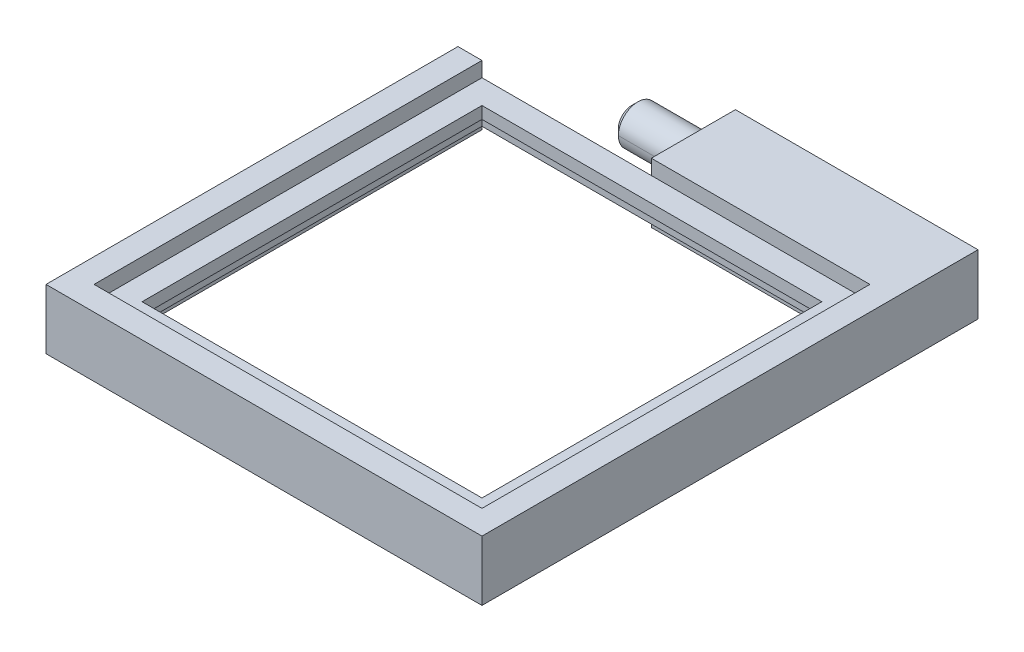
ISO-10303-21;
HEADER;
FILE_DESCRIPTION(('STEP AP214'),'2;1');
FILE_NAME('part.step','',(''),(''),'','','');
FILE_SCHEMA(('AUTOMOTIVE_DESIGN { 1 0 10303 214 1 1 1 1 }'));
ENDSEC;
DATA;
#1=APPLICATION_CONTEXT('core data for automotive mechanical design processes');
#2=APPLICATION_PROTOCOL_DEFINITION('international standard','automotive_design',2000,#1);
#3=PRODUCT_CONTEXT('',#1,'mechanical');
#4=PRODUCT('Part','Part','',(#3));
#5=PRODUCT_RELATED_PRODUCT_CATEGORY('part','',(#4));
#6=PRODUCT_DEFINITION_FORMATION('','',#4);
#7=PRODUCT_DEFINITION_CONTEXT('part definition',#1,'design');
#8=PRODUCT_DEFINITION('design','',#6,#7);
#9=PRODUCT_DEFINITION_SHAPE('','',#8);
#10=(LENGTH_UNIT() NAMED_UNIT(*) SI_UNIT(.MILLI.,.METRE.));
#11=(NAMED_UNIT(*) PLANE_ANGLE_UNIT() SI_UNIT($,.RADIAN.));
#12=(NAMED_UNIT(*) SI_UNIT($,.STERADIAN.) SOLID_ANGLE_UNIT());
#13=UNCERTAINTY_MEASURE_WITH_UNIT(LENGTH_MEASURE(1.E-05),#10,'distance_accuracy_value','');
#14=(GEOMETRIC_REPRESENTATION_CONTEXT(3) GLOBAL_UNCERTAINTY_ASSIGNED_CONTEXT((#13)) GLOBAL_UNIT_ASSIGNED_CONTEXT((#10,
#11,#12)) REPRESENTATION_CONTEXT('',''));
#15=CARTESIAN_POINT('',(0.,0.,0.));
#16=DIRECTION('',(0.,0.,1.));
#17=DIRECTION('',(1.,0.,0.));
#18=AXIS2_PLACEMENT_3D('',#15,#16,#17);
#19=CARTESIAN_POINT('',(8.1,1.25,-36.68));
#20=DIRECTION('',(1.,0.,0.));
#21=DIRECTION('',(0.,0.,-1.));
#22=AXIS2_PLACEMENT_3D('',#19,#20,#21);
#23=CONICAL_SURFACE('',#22,1.125,0.785398163397448);
#24=DIRECTION('',(0.707106781186548,0.,0.707106781186547));
#25=VECTOR('',#24,1.);
#26=CARTESIAN_POINT('',(8.1,1.25,-35.555));
#27=LINE('',#26,#25);
#28=CARTESIAN_POINT('',(8.1,1.25,-35.555));
#29=VERTEX_POINT('',#28);
#30=CARTESIAN_POINT('',(8.6,1.25,-35.055));
#31=VERTEX_POINT('',#30);
#32=EDGE_CURVE('E335',#29,#31,#27,.T.);
#33=ORIENTED_EDGE('',*,*,#32,.F.);
#34=CARTESIAN_POINT('',(8.1,1.25,-36.68));
#35=DIRECTION('',(-1.,0.,0.));
#36=DIRECTION('',(0.,0.,1.));
#37=AXIS2_PLACEMENT_3D('',#34,#35,#36);
#38=CIRCLE('',#37,1.125);
#39=CARTESIAN_POINT('',(8.1,1.25,-37.805));
#40=VERTEX_POINT('',#39);
#41=EDGE_CURVE('E11',#40,#29,#38,.T.);
#42=ORIENTED_EDGE('',*,*,#41,.F.);
#43=DIRECTION('',(0.707106781186548,0.,-0.707106781186547));
#44=VECTOR('',#43,1.);
#45=CARTESIAN_POINT('',(8.1,1.25,-37.805));
#46=LINE('',#45,#44);
#47=CARTESIAN_POINT('',(8.6,1.25,-38.305));
#48=VERTEX_POINT('',#47);
#49=EDGE_CURVE('E365',#40,#48,#46,.T.);
#50=ORIENTED_EDGE('',*,*,#49,.T.);
#51=CARTESIAN_POINT('',(8.6,1.25,-36.68));
#52=DIRECTION('',(1.,0.,0.));
#53=DIRECTION('',(0.,0.,1.));
#54=AXIS2_PLACEMENT_3D('',#51,#52,#53);
#55=CIRCLE('',#54,1.625);
#56=EDGE_CURVE('E435',#31,#48,#55,.T.);
#57=ORIENTED_EDGE('',*,*,#56,.F.);
#58=EDGE_LOOP('',(#33,#42,#50,#57));
#59=FACE_BOUND('',#58,.T.);
#60=ADVANCED_FACE('F44',(#59),#23,.T.);
#61=CARTESIAN_POINT('',(13.6,1.25,-36.68));
#62=DIRECTION('',(1.,0.,0.));
#63=DIRECTION('',(0.,0.,-1.));
#64=AXIS2_PLACEMENT_3D('',#61,#62,#63);
#65=CONICAL_SURFACE('',#64,1.625,0.785398163397445);
#66=DIRECTION('',(0.707106781186551,0.,0.707106781186545));
#67=VECTOR('',#66,1.);
#68=CARTESIAN_POINT('',(13.6,1.25,-35.055));
#69=LINE('',#68,#67);
#70=CARTESIAN_POINT('',(13.6,1.25,-35.055));
#71=VERTEX_POINT('',#70);
#72=CARTESIAN_POINT('',(14.1,1.25,-34.555));
#73=VERTEX_POINT('',#72);
#74=EDGE_CURVE('E345',#71,#73,#69,.T.);
#75=ORIENTED_EDGE('',*,*,#74,.F.);
#76=CARTESIAN_POINT('',(13.6,1.25,-36.68));
#77=DIRECTION('',(-1.,0.,0.));
#78=DIRECTION('',(0.,0.,-1.));
#79=AXIS2_PLACEMENT_3D('',#76,#77,#78);
#80=CIRCLE('',#79,1.625);
#81=CARTESIAN_POINT('',(13.6,1.25,-38.305));
#82=VERTEX_POINT('',#81);
#83=EDGE_CURVE('E48',#82,#71,#80,.T.);
#84=ORIENTED_EDGE('',*,*,#83,.F.);
#85=DIRECTION('',(0.707106781186551,0.,-0.707106781186545));
#86=VECTOR('',#85,1.);
#87=CARTESIAN_POINT('',(13.6,1.25,-38.305));
#88=LINE('',#87,#86);
#89=CARTESIAN_POINT('',(14.1,1.25,-38.805));
#90=VERTEX_POINT('',#89);
#91=EDGE_CURVE('E331',#82,#90,#88,.T.);
#92=ORIENTED_EDGE('',*,*,#91,.T.);
#93=CARTESIAN_POINT('',(14.1,1.25,-36.68));
#94=DIRECTION('',(1.,0.,0.));
#95=DIRECTION('',(0.,0.,-1.));
#96=AXIS2_PLACEMENT_3D('',#93,#94,#95);
#97=CIRCLE('',#96,2.125);
#98=EDGE_CURVE('E513',#73,#90,#97,.T.);
#99=ORIENTED_EDGE('',*,*,#98,.F.);
#100=EDGE_LOOP('',(#75,#84,#92,#99));
#101=FACE_BOUND('',#100,.T.);
#102=ADVANCED_FACE('F554',(#101),#65,.T.);
#103=CARTESIAN_POINT('',(8.1,1.25,-36.68));
#104=DIRECTION('',(-1.,0.,0.));
#105=DIRECTION('',(0.,0.,1.));
#106=AXIS2_PLACEMENT_3D('',#103,#104,#105);
#107=PLANE('',#106);
#108=ORIENTED_EDGE('',*,*,#41,.T.);
#109=CARTESIAN_POINT('',(8.1,1.25,-36.68));
#110=DIRECTION('',(-1.,0.,0.));
#111=DIRECTION('',(0.,0.,1.));
#112=AXIS2_PLACEMENT_3D('',#109,#110,#111);
#113=CIRCLE('',#112,1.125);
#114=EDGE_CURVE('E329',#29,#40,#113,.T.);
#115=ORIENTED_EDGE('',*,*,#114,.T.);
#116=EDGE_LOOP('',(#108,#115));
#117=FACE_BOUND('',#116,.T.);
#118=ADVANCED_FACE('F631',(#117),#107,.T.);
#119=CARTESIAN_POINT('',(8.1,1.25,-36.68));
#120=DIRECTION('',(1.,0.,0.));
#121=DIRECTION('',(0.,0.,-1.));
#122=AXIS2_PLACEMENT_3D('',#119,#120,#121);
#123=CYLINDRICAL_SURFACE('',#122,1.625);
#124=DIRECTION('',(1.,0.,0.));
#125=VECTOR('',#124,1.);
#126=CARTESIAN_POINT('',(8.1,1.25,-35.055));
#127=LINE('',#126,#125);
#128=EDGE_CURVE('E340',#31,#71,#127,.T.);
#129=ORIENTED_EDGE('',*,*,#128,.F.);
#130=ORIENTED_EDGE('',*,*,#56,.T.);
#131=DIRECTION('',(1.,0.,0.));
#132=VECTOR('',#131,1.);
#133=CARTESIAN_POINT('',(8.1,1.25,-38.305));
#134=LINE('',#133,#132);
#135=EDGE_CURVE('E398',#48,#82,#134,.T.);
#136=ORIENTED_EDGE('',*,*,#135,.T.);
#137=ORIENTED_EDGE('',*,*,#83,.T.);
#138=EDGE_LOOP('',(#129,#130,#136,#137));
#139=FACE_BOUND('',#138,.T.);
#140=ADVANCED_FACE('F544',(#139),#123,.T.);
#141=CARTESIAN_POINT('',(0.,0.,-32.3));
#142=DIRECTION('',(0.,0.,1.));
#143=DIRECTION('',(1.,0.,0.));
#144=AXIS2_PLACEMENT_3D('',#141,#142,#143);
#145=PLANE('',#144);
#146=DIRECTION('',(0.,-1.,0.));
#147=VECTOR('',#146,1.);
#148=CARTESIAN_POINT('',(32.3,3.75,-32.3));
#149=LINE('',#148,#147);
#150=CARTESIAN_POINT('',(32.3,0.,-32.3));
#151=VERTEX_POINT('',#150);
#152=CARTESIAN_POINT('',(32.3,-1.25,-32.3));
#153=VERTEX_POINT('',#152);
#154=EDGE_CURVE('E385',#151,#153,#149,.T.);
#155=ORIENTED_EDGE('',*,*,#154,.F.);
#156=DIRECTION('',(-1.,0.,0.));
#157=VECTOR('',#156,1.);
#158=CARTESIAN_POINT('',(0.,0.,-32.3));
#159=LINE('',#158,#157);
#160=CARTESIAN_POINT('',(14.1,0.,-32.3));
#161=VERTEX_POINT('',#160);
#162=EDGE_CURVE('E485',#151,#161,#159,.T.);
#163=ORIENTED_EDGE('',*,*,#162,.T.);
#164=DIRECTION('',(0.,1.,0.));
#165=VECTOR('',#164,1.);
#166=CARTESIAN_POINT('',(14.1,3.75,-32.3));
#167=LINE('',#166,#165);
#168=CARTESIAN_POINT('',(14.1,-1.25,-32.3));
#169=VERTEX_POINT('',#168);
#170=EDGE_CURVE('E370',#169,#161,#167,.T.);
#171=ORIENTED_EDGE('',*,*,#170,.F.);
#172=DIRECTION('',(-1.,0.,0.));
#173=VECTOR('',#172,1.);
#174=CARTESIAN_POINT('',(14.1,-1.25,-32.3));
#175=LINE('',#174,#173);
#176=EDGE_CURVE('E431',#153,#169,#175,.T.);
#177=ORIENTED_EDGE('',*,*,#176,.F.);
#178=EDGE_LOOP('',(#155,#163,#171,#177));
#179=FACE_BOUND('',#178,.T.);
#180=ADVANCED_FACE('F572',(#179),#145,.T.);
#181=CARTESIAN_POINT('',(0.,0.,-39.3));
#182=DIRECTION('',(0.,0.,1.));
#183=DIRECTION('',(1.,0.,0.));
#184=AXIS2_PLACEMENT_3D('',#181,#182,#183);
#185=PLANE('',#184);
#186=DIRECTION('',(0.,1.,0.));
#187=VECTOR('',#186,1.);
#188=CARTESIAN_POINT('',(14.1,3.75,-39.3));
#189=LINE('',#188,#187);
#190=CARTESIAN_POINT('',(14.1,-1.25,-39.3));
#191=VERTEX_POINT('',#190);
#192=CARTESIAN_POINT('',(14.1,3.75,-39.3));
#193=VERTEX_POINT('',#192);
#194=EDGE_CURVE('E515',#191,#193,#189,.T.);
#195=ORIENTED_EDGE('',*,*,#194,.T.);
#196=DIRECTION('',(1.,0.,0.));
#197=VECTOR('',#196,1.);
#198=CARTESIAN_POINT('',(14.1,3.75,-39.3));
#199=LINE('',#198,#197);
#200=CARTESIAN_POINT('',(34.3,3.75,-39.3));
#201=VERTEX_POINT('',#200);
#202=EDGE_CURVE('E77',#193,#201,#199,.T.);
#203=ORIENTED_EDGE('',*,*,#202,.T.);
#204=DIRECTION('',(0.,-1.,0.));
#205=VECTOR('',#204,1.);
#206=CARTESIAN_POINT('',(34.3,58.735270754994,-39.3));
#207=LINE('',#206,#205);
#208=CARTESIAN_POINT('',(34.3,-1.25,-39.3));
#209=VERTEX_POINT('',#208);
#210=EDGE_CURVE('E321',#201,#209,#207,.T.);
#211=ORIENTED_EDGE('',*,*,#210,.T.);
#212=DIRECTION('',(-1.,0.,0.));
#213=VECTOR('',#212,1.);
#214=CARTESIAN_POINT('',(14.1,-1.25,-39.3));
#215=LINE('',#214,#213);
#216=EDGE_CURVE('E67',#209,#191,#215,.T.);
#217=ORIENTED_EDGE('',*,*,#216,.T.);
#218=EDGE_LOOP('',(#195,#203,#211,#217));
#219=FACE_BOUND('',#218,.T.);
#220=ADVANCED_FACE('F614',(#219),#185,.F.);
#221=CARTESIAN_POINT('',(14.1,-1.25,-39.3));
#222=DIRECTION('',(0.,1.,0.));
#223=DIRECTION('',(1.,0.,0.));
#224=AXIS2_PLACEMENT_3D('',#221,#222,#223);
#225=PLANE('',#224);
#226=ORIENTED_EDGE('',*,*,#176,.T.);
#227=DIRECTION('',(0.,0.,1.));
#228=VECTOR('',#227,1.);
#229=CARTESIAN_POINT('',(14.1,-1.25,-39.3));
#230=LINE('',#229,#228);
#231=EDGE_CURVE('E510',#191,#169,#230,.T.);
#232=ORIENTED_EDGE('',*,*,#231,.F.);
#233=ORIENTED_EDGE('',*,*,#216,.F.);
#234=DIRECTION('',(0.,0.,1.));
#235=VECTOR('',#234,1.);
#236=CARTESIAN_POINT('',(34.3,-1.25,-39.3));
#237=LINE('',#236,#235);
#238=CARTESIAN_POINT('',(34.3,-1.25,2.));
#239=VERTEX_POINT('',#238);
#240=EDGE_CURVE('E303',#209,#239,#237,.T.);
#241=ORIENTED_EDGE('',*,*,#240,.T.);
#242=DIRECTION('',(-1.,0.,0.));
#243=VECTOR('',#242,1.);
#244=CARTESIAN_POINT('',(34.2417068542968,-1.25,2.));
#245=LINE('',#244,#243);
#246=CARTESIAN_POINT('',(-2.,-1.25,2.));
#247=VERTEX_POINT('',#246);
#248=EDGE_CURVE('E305',#239,#247,#245,.T.);
#249=ORIENTED_EDGE('',*,*,#248,.T.);
#250=DIRECTION('',(0.,0.,-1.));
#251=VECTOR('',#250,1.);
#252=CARTESIAN_POINT('',(-2.,-1.25,-32.3));
#253=LINE('',#252,#251);
#254=CARTESIAN_POINT('',(-2.,-1.25,-32.3));
#255=VERTEX_POINT('',#254);
#256=EDGE_CURVE('E310',#247,#255,#253,.T.);
#257=ORIENTED_EDGE('',*,*,#256,.T.);
#258=DIRECTION('',(1.,0.,0.));
#259=VECTOR('',#258,1.);
#260=CARTESIAN_POINT('',(0.,-1.25,-32.3));
#261=LINE('',#260,#259);
#262=CARTESIAN_POINT('',(0.,-1.25,-32.3));
#263=VERTEX_POINT('',#262);
#264=EDGE_CURVE('E279',#255,#263,#261,.T.);
#265=ORIENTED_EDGE('',*,*,#264,.T.);
#266=DIRECTION('',(0.,0.,1.));
#267=VECTOR('',#266,1.);
#268=CARTESIAN_POINT('',(0.,-1.25,-32.3));
#269=LINE('',#268,#267);
#270=CARTESIAN_POINT('',(0.,-1.25,0.));
#271=VERTEX_POINT('',#270);
#272=EDGE_CURVE('E273',#263,#271,#269,.T.);
#273=ORIENTED_EDGE('',*,*,#272,.T.);
#274=DIRECTION('',(1.,0.,0.));
#275=VECTOR('',#274,1.);
#276=CARTESIAN_POINT('',(32.3,-1.25,0.));
#277=LINE('',#276,#275);
#278=CARTESIAN_POINT('',(32.3,-1.25,0.));
#279=VERTEX_POINT('',#278);
#280=EDGE_CURVE('E284',#271,#279,#277,.T.);
#281=ORIENTED_EDGE('',*,*,#280,.T.);
#282=DIRECTION('',(0.,0.,-1.));
#283=VECTOR('',#282,1.);
#284=CARTESIAN_POINT('',(32.3,-1.25,-39.3));
#285=LINE('',#284,#283);
#286=EDGE_CURVE('E289',#279,#153,#285,.T.);
#287=ORIENTED_EDGE('',*,*,#286,.T.);
#288=EDGE_LOOP('',(#226,#232,#233,#241,#249,#257,#265,#273,#281,#287));
#289=FACE_BOUND('',#288,.T.);
#290=ADVANCED_FACE('F295',(#289),#225,.F.);
#291=CARTESIAN_POINT('',(14.1,3.75,-39.3));
#292=DIRECTION('',(0.,-1.,0.));
#293=DIRECTION('',(-1.,0.,0.));
#294=AXIS2_PLACEMENT_3D('',#291,#292,#293);
#295=PLANE('',#294);
#296=DIRECTION('',(1.,0.,0.));
#297=VECTOR('',#296,1.);
#298=CARTESIAN_POINT('',(14.1,3.75,-32.3));
#299=LINE('',#298,#297);
#300=CARTESIAN_POINT('',(14.1,3.75,-32.3));
#301=VERTEX_POINT('',#300);
#302=CARTESIAN_POINT('',(32.3,3.75,-32.3));
#303=VERTEX_POINT('',#302);
#304=EDGE_CURVE('E367',#301,#303,#299,.T.);
#305=ORIENTED_EDGE('',*,*,#304,.T.);
#306=DIRECTION('',(0.,0.,1.));
#307=VECTOR('',#306,1.);
#308=CARTESIAN_POINT('',(32.3,3.75,-39.3));
#309=LINE('',#308,#307);
#310=CARTESIAN_POINT('',(32.3,3.75,0.));
#311=VERTEX_POINT('',#310);
#312=EDGE_CURVE('E313',#303,#311,#309,.T.);
#313=ORIENTED_EDGE('',*,*,#312,.T.);
#314=DIRECTION('',(-1.,0.,0.));
#315=VECTOR('',#314,1.);
#316=CARTESIAN_POINT('',(32.3,3.75,0.));
#317=LINE('',#316,#315);
#318=CARTESIAN_POINT('',(0.,3.75000000000001,0.));
#319=VERTEX_POINT('',#318);
#320=EDGE_CURVE('E327',#311,#319,#317,.T.);
#321=ORIENTED_EDGE('',*,*,#320,.T.);
#322=DIRECTION('',(0.,0.,-1.));
#323=VECTOR('',#322,1.);
#324=CARTESIAN_POINT('',(0.,3.75,-32.3));
#325=LINE('',#324,#323);
#326=CARTESIAN_POINT('',(0.,3.75,-32.3));
#327=VERTEX_POINT('',#326);
#328=EDGE_CURVE('E300',#319,#327,#325,.T.);
#329=ORIENTED_EDGE('',*,*,#328,.T.);
#330=DIRECTION('',(-1.,0.,0.));
#331=VECTOR('',#330,1.);
#332=CARTESIAN_POINT('',(0.,3.75,-32.3));
#333=LINE('',#332,#331);
#334=CARTESIAN_POINT('',(-2.,3.75,-32.3));
#335=VERTEX_POINT('',#334);
#336=EDGE_CURVE('E603',#327,#335,#333,.T.);
#337=ORIENTED_EDGE('',*,*,#336,.T.);
#338=DIRECTION('',(0.,0.,1.));
#339=VECTOR('',#338,1.);
#340=CARTESIAN_POINT('',(-2.,3.75,-32.3));
#341=LINE('',#340,#339);
#342=CARTESIAN_POINT('',(-2.,3.75000000000001,2.));
#343=VERTEX_POINT('',#342);
#344=EDGE_CURVE('E605',#335,#343,#341,.T.);
#345=ORIENTED_EDGE('',*,*,#344,.T.);
#346=DIRECTION('',(1.,0.,0.));
#347=VECTOR('',#346,1.);
#348=CARTESIAN_POINT('',(34.2417068542968,3.75,2.));
#349=LINE('',#348,#347);
#350=CARTESIAN_POINT('',(34.3,3.75,2.));
#351=VERTEX_POINT('',#350);
#352=EDGE_CURVE('E602',#343,#351,#349,.T.);
#353=ORIENTED_EDGE('',*,*,#352,.T.);
#354=DIRECTION('',(0.,0.,-1.));
#355=VECTOR('',#354,1.);
#356=CARTESIAN_POINT('',(34.3,3.75,-39.3));
#357=LINE('',#356,#355);
#358=EDGE_CURVE('E595',#351,#201,#357,.T.);
#359=ORIENTED_EDGE('',*,*,#358,.T.);
#360=ORIENTED_EDGE('',*,*,#202,.F.);
#361=DIRECTION('',(0.,0.,1.));
#362=VECTOR('',#361,1.);
#363=CARTESIAN_POINT('',(14.1,3.75,-39.3));
#364=LINE('',#363,#362);
#365=EDGE_CURVE('E518',#193,#301,#364,.T.);
#366=ORIENTED_EDGE('',*,*,#365,.T.);
#367=EDGE_LOOP('',(#305,#313,#321,#329,#337,#345,#353,#359,#360,#366));
#368=FACE_BOUND('',#367,.T.);
#369=ADVANCED_FACE('F565',(#368),#295,.F.);
#370=CARTESIAN_POINT('',(14.1,3.75,-39.3));
#371=DIRECTION('',(1.,0.,0.));
#372=DIRECTION('',(0.,1.,0.));
#373=AXIS2_PLACEMENT_3D('',#370,#371,#372);
#374=PLANE('',#373);
#375=CARTESIAN_POINT('',(14.1,1.25,-36.68));
#376=DIRECTION('',(1.,0.,0.));
#377=DIRECTION('',(0.,0.,-1.));
#378=AXIS2_PLACEMENT_3D('',#375,#376,#377);
#379=CIRCLE('',#378,2.125);
#380=EDGE_CURVE('E336',#90,#73,#379,.T.);
#381=ORIENTED_EDGE('',*,*,#380,.T.);
#382=ORIENTED_EDGE('',*,*,#98,.T.);
#383=EDGE_LOOP('',(#381,#382));
#384=FACE_BOUND('',#383,.T.);
#385=ORIENTED_EDGE('',*,*,#170,.T.);
#386=DIRECTION('',(0.,1.,0.));
#387=VECTOR('',#386,1.);
#388=CARTESIAN_POINT('',(14.1,3.75,-32.3));
#389=LINE('',#388,#387);
#390=CARTESIAN_POINT('',(14.1,2.5,-32.3));
#391=VERTEX_POINT('',#390);
#392=EDGE_CURVE('E371',#161,#391,#389,.T.);
#393=ORIENTED_EDGE('',*,*,#392,.T.);
#394=DIRECTION('',(0.,1.,0.));
#395=VECTOR('',#394,1.);
#396=CARTESIAN_POINT('',(14.1,3.75,-32.3));
#397=LINE('',#396,#395);
#398=EDGE_CURVE('E363',#391,#301,#397,.T.);
#399=ORIENTED_EDGE('',*,*,#398,.T.);
#400=ORIENTED_EDGE('',*,*,#365,.F.);
#401=ORIENTED_EDGE('',*,*,#194,.F.);
#402=ORIENTED_EDGE('',*,*,#231,.T.);
#403=EDGE_LOOP('',(#385,#393,#399,#400,#401,#402));
#404=FACE_BOUND('',#403,.T.);
#405=ADVANCED_FACE('F556',(#384,#404),#374,.F.);
#406=CARTESIAN_POINT('',(0.,0.,-32.3));
#407=DIRECTION('',(0.,0.,1.));
#408=DIRECTION('',(1.,0.,0.));
#409=AXIS2_PLACEMENT_3D('',#406,#407,#408);
#410=PLANE('',#409);
#411=DIRECTION('',(-1.,0.,0.));
#412=VECTOR('',#411,1.);
#413=CARTESIAN_POINT('',(0.,2.5,-32.3));
#414=LINE('',#413,#412);
#415=CARTESIAN_POINT('',(32.3,2.5,-32.3));
#416=VERTEX_POINT('',#415);
#417=EDGE_CURVE('E347',#416,#391,#414,.T.);
#418=ORIENTED_EDGE('',*,*,#417,.F.);
#419=DIRECTION('',(0.,-1.,0.));
#420=VECTOR('',#419,1.);
#421=CARTESIAN_POINT('',(32.3,3.75,-32.3));
#422=LINE('',#421,#420);
#423=EDGE_CURVE('E406',#303,#416,#422,.T.);
#424=ORIENTED_EDGE('',*,*,#423,.F.);
#425=ORIENTED_EDGE('',*,*,#304,.F.);
#426=ORIENTED_EDGE('',*,*,#398,.F.);
#427=EDGE_LOOP('',(#418,#424,#425,#426));
#428=FACE_BOUND('',#427,.T.);
#429=ADVANCED_FACE('F562',(#428),#410,.T.);
#430=CARTESIAN_POINT('',(2.,1.5,-30.3));
#431=DIRECTION('',(-1.,0.,0.));
#432=DIRECTION('',(0.,0.,1.));
#433=AXIS2_PLACEMENT_3D('',#430,#431,#432);
#434=PLANE('',#433);
#435=DIRECTION('',(0.,0.,1.));
#436=VECTOR('',#435,1.);
#437=CARTESIAN_POINT('',(2.,2.5,-30.3));
#438=LINE('',#437,#436);
#439=CARTESIAN_POINT('',(2.,2.5,-30.3));
#440=VERTEX_POINT('',#439);
#441=CARTESIAN_POINT('',(2.,2.5,-2.));
#442=VERTEX_POINT('',#441);
#443=EDGE_CURVE('E476',#440,#442,#438,.T.);
#444=ORIENTED_EDGE('',*,*,#443,.T.);
#445=DIRECTION('',(0.,1.,0.));
#446=VECTOR('',#445,1.);
#447=CARTESIAN_POINT('',(2.,1.5,-2.));
#448=LINE('',#447,#446);
#449=CARTESIAN_POINT('',(2.,1.5,-2.));
#450=VERTEX_POINT('',#449);
#451=EDGE_CURVE('E517',#450,#442,#448,.T.);
#452=ORIENTED_EDGE('',*,*,#451,.F.);
#453=DIRECTION('',(0.,0.,1.));
#454=VECTOR('',#453,1.);
#455=CARTESIAN_POINT('',(2.,1.5,-30.3));
#456=LINE('',#455,#454);
#457=CARTESIAN_POINT('',(2.,1.5,-30.3));
#458=VERTEX_POINT('',#457);
#459=EDGE_CURVE('E497',#458,#450,#456,.T.);
#460=ORIENTED_EDGE('',*,*,#459,.F.);
#461=DIRECTION('',(0.,1.,0.));
#462=VECTOR('',#461,1.);
#463=CARTESIAN_POINT('',(2.,1.5,-30.3));
#464=LINE('',#463,#462);
#465=EDGE_CURVE('E469',#458,#440,#464,.T.);
#466=ORIENTED_EDGE('',*,*,#465,.T.);
#467=EDGE_LOOP('',(#444,#452,#460,#466));
#468=FACE_BOUND('',#467,.T.);
#469=ADVANCED_FACE('F669',(#468),#434,.F.);
#470=CARTESIAN_POINT('',(2.,1.5,-2.));
#471=DIRECTION('',(0.,0.,1.));
#472=DIRECTION('',(1.,0.,0.));
#473=AXIS2_PLACEMENT_3D('',#470,#471,#472);
#474=PLANE('',#473);
#475=DIRECTION('',(1.,0.,0.));
#476=VECTOR('',#475,1.);
#477=CARTESIAN_POINT('',(2.,2.5,-2.));
#478=LINE('',#477,#476);
#479=CARTESIAN_POINT('',(30.3,2.5,-2.));
#480=VERTEX_POINT('',#479);
#481=EDGE_CURVE('E474',#442,#480,#478,.T.);
#482=ORIENTED_EDGE('',*,*,#481,.T.);
#483=DIRECTION('',(0.,1.,0.));
#484=VECTOR('',#483,1.);
#485=CARTESIAN_POINT('',(30.3,1.5,-2.));
#486=LINE('',#485,#484);
#487=CARTESIAN_POINT('',(30.3,1.5,-2.));
#488=VERTEX_POINT('',#487);
#489=EDGE_CURVE('E467',#488,#480,#486,.T.);
#490=ORIENTED_EDGE('',*,*,#489,.F.);
#491=DIRECTION('',(1.,0.,0.));
#492=VECTOR('',#491,1.);
#493=CARTESIAN_POINT('',(2.,1.5,-2.));
#494=LINE('',#493,#492);
#495=EDGE_CURVE('E502',#450,#488,#494,.T.);
#496=ORIENTED_EDGE('',*,*,#495,.F.);
#497=ORIENTED_EDGE('',*,*,#451,.T.);
#498=EDGE_LOOP('',(#482,#490,#496,#497));
#499=FACE_BOUND('',#498,.T.);
#500=ADVANCED_FACE('F675',(#499),#474,.F.);
#501=CARTESIAN_POINT('',(30.3,1.5,-2.));
#502=DIRECTION('',(1.,0.,0.));
#503=DIRECTION('',(0.,1.,0.));
#504=AXIS2_PLACEMENT_3D('',#501,#502,#503);
#505=PLANE('',#504);
#506=DIRECTION('',(0.,0.,-1.));
#507=VECTOR('',#506,1.);
#508=CARTESIAN_POINT('',(30.3,2.5,-2.));
#509=LINE('',#508,#507);
#510=CARTESIAN_POINT('',(30.3,2.5,-30.3));
#511=VERTEX_POINT('',#510);
#512=EDGE_CURVE('E463',#480,#511,#509,.T.);
#513=ORIENTED_EDGE('',*,*,#512,.T.);
#514=DIRECTION('',(0.,1.,0.));
#515=VECTOR('',#514,1.);
#516=CARTESIAN_POINT('',(30.3,1.5,-30.3));
#517=LINE('',#516,#515);
#518=CARTESIAN_POINT('',(30.3,1.5,-30.3));
#519=VERTEX_POINT('',#518);
#520=EDGE_CURVE('E468',#519,#511,#517,.T.);
#521=ORIENTED_EDGE('',*,*,#520,.F.);
#522=DIRECTION('',(0.,0.,-1.));
#523=VECTOR('',#522,1.);
#524=CARTESIAN_POINT('',(30.3,1.5,-2.));
#525=LINE('',#524,#523);
#526=EDGE_CURVE('E407',#488,#519,#525,.T.);
#527=ORIENTED_EDGE('',*,*,#526,.F.);
#528=ORIENTED_EDGE('',*,*,#489,.T.);
#529=EDGE_LOOP('',(#513,#521,#527,#528));
#530=FACE_BOUND('',#529,.T.);
#531=ADVANCED_FACE('F682',(#530),#505,.F.);
#532=CARTESIAN_POINT('',(30.3,1.5,-30.3));
#533=DIRECTION('',(0.,0.,-1.));
#534=DIRECTION('',(0.,-1.,0.));
#535=AXIS2_PLACEMENT_3D('',#532,#533,#534);
#536=PLANE('',#535);
#537=DIRECTION('',(-1.,0.,0.));
#538=VECTOR('',#537,1.);
#539=CARTESIAN_POINT('',(30.3,2.5,-30.3));
#540=LINE('',#539,#538);
#541=EDGE_CURVE('E353',#511,#440,#540,.T.);
#542=ORIENTED_EDGE('',*,*,#541,.T.);
#543=ORIENTED_EDGE('',*,*,#465,.F.);
#544=DIRECTION('',(-1.,0.,0.));
#545=VECTOR('',#544,1.);
#546=CARTESIAN_POINT('',(30.3,1.5,-30.3));
#547=LINE('',#546,#545);
#548=EDGE_CURVE('E494',#519,#458,#547,.T.);
#549=ORIENTED_EDGE('',*,*,#548,.F.);
#550=ORIENTED_EDGE('',*,*,#520,.T.);
#551=EDGE_LOOP('',(#542,#543,#549,#550));
#552=FACE_BOUND('',#551,.T.);
#553=ADVANCED_FACE('F694',(#552),#536,.F.);
#554=CARTESIAN_POINT('',(0.,1.5,0.));
#555=DIRECTION('',(0.,1.,0.));
#556=DIRECTION('',(1.,0.,0.));
#557=AXIS2_PLACEMENT_3D('',#554,#555,#556);
#558=PLANE('',#557);
#559=ORIENTED_EDGE('',*,*,#526,.T.);
#560=ORIENTED_EDGE('',*,*,#548,.T.);
#561=ORIENTED_EDGE('',*,*,#459,.T.);
#562=ORIENTED_EDGE('',*,*,#495,.T.);
#563=EDGE_LOOP('',(#559,#560,#561,#562));
#564=FACE_BOUND('',#563,.T.);
#565=DIRECTION('',(0.,0.,1.));
#566=VECTOR('',#565,1.);
#567=CARTESIAN_POINT('',(1.,1.5,-31.3));
#568=LINE('',#567,#566);
#569=CARTESIAN_POINT('',(1.,1.5,-31.3));
#570=VERTEX_POINT('',#569);
#571=CARTESIAN_POINT('',(1.,1.5,-1.));
#572=VERTEX_POINT('',#571);
#573=EDGE_CURVE('E442',#570,#572,#568,.T.);
#574=ORIENTED_EDGE('',*,*,#573,.F.);
#575=DIRECTION('',(-1.,0.,0.));
#576=VECTOR('',#575,1.);
#577=CARTESIAN_POINT('',(31.3,1.5,-31.3));
#578=LINE('',#577,#576);
#579=CARTESIAN_POINT('',(31.3,1.5,-31.3));
#580=VERTEX_POINT('',#579);
#581=EDGE_CURVE('E429',#580,#570,#578,.T.);
#582=ORIENTED_EDGE('',*,*,#581,.F.);
#583=DIRECTION('',(0.,0.,-1.));
#584=VECTOR('',#583,1.);
#585=CARTESIAN_POINT('',(31.3,1.5,-1.));
#586=LINE('',#585,#584);
#587=CARTESIAN_POINT('',(31.3,1.5,-1.));
#588=VERTEX_POINT('',#587);
#589=EDGE_CURVE('E420',#588,#580,#586,.T.);
#590=ORIENTED_EDGE('',*,*,#589,.F.);
#591=DIRECTION('',(1.,0.,0.));
#592=VECTOR('',#591,1.);
#593=CARTESIAN_POINT('',(1.,1.5,-1.));
#594=LINE('',#593,#592);
#595=EDGE_CURVE('E351',#572,#588,#594,.T.);
#596=ORIENTED_EDGE('',*,*,#595,.F.);
#597=EDGE_LOOP('',(#574,#582,#590,#596));
#598=FACE_BOUND('',#597,.T.);
#599=ADVANCED_FACE('F695',(#564,#598),#558,.F.);
#600=CARTESIAN_POINT('',(0.,0.,0.));
#601=DIRECTION('',(0.,-1.,0.));
#602=DIRECTION('',(0.,0.,-1.));
#603=AXIS2_PLACEMENT_3D('',#600,#601,#602);
#604=PLANE('',#603);
#605=DIRECTION('',(0.,0.,1.));
#606=VECTOR('',#605,1.);
#607=CARTESIAN_POINT('',(1.,0.,-1.));
#608=LINE('',#607,#606);
#609=CARTESIAN_POINT('',(1.,0.,-31.3));
#610=VERTEX_POINT('',#609);
#611=CARTESIAN_POINT('',(1.,0.,-1.));
#612=VERTEX_POINT('',#611);
#613=EDGE_CURVE('E446',#610,#612,#608,.T.);
#614=ORIENTED_EDGE('',*,*,#613,.T.);
#615=DIRECTION('',(1.,0.,0.));
#616=VECTOR('',#615,1.);
#617=CARTESIAN_POINT('',(1.,0.,-1.));
#618=LINE('',#617,#616);
#619=CARTESIAN_POINT('',(31.3,0.,-1.));
#620=VERTEX_POINT('',#619);
#621=EDGE_CURVE('E412',#612,#620,#618,.T.);
#622=ORIENTED_EDGE('',*,*,#621,.T.);
#623=DIRECTION('',(0.,0.,-1.));
#624=VECTOR('',#623,1.);
#625=CARTESIAN_POINT('',(31.3,0.,-1.));
#626=LINE('',#625,#624);
#627=CARTESIAN_POINT('',(31.3,0.,-31.3));
#628=VERTEX_POINT('',#627);
#629=EDGE_CURVE('E424',#620,#628,#626,.T.);
#630=ORIENTED_EDGE('',*,*,#629,.T.);
#631=DIRECTION('',(-1.,0.,0.));
#632=VECTOR('',#631,1.);
#633=CARTESIAN_POINT('',(1.,0.,-31.3));
#634=LINE('',#633,#632);
#635=EDGE_CURVE('E443',#628,#610,#634,.T.);
#636=ORIENTED_EDGE('',*,*,#635,.T.);
#637=EDGE_LOOP('',(#614,#622,#630,#636));
#638=FACE_BOUND('',#637,.T.);
#639=DIRECTION('',(0.,0.,1.));
#640=VECTOR('',#639,1.);
#641=CARTESIAN_POINT('',(0.,0.,0.));
#642=LINE('',#641,#640);
#643=CARTESIAN_POINT('',(0.,0.,-32.3));
#644=VERTEX_POINT('',#643);
#645=CARTESIAN_POINT('',(0.,0.,0.));
#646=VERTEX_POINT('',#645);
#647=EDGE_CURVE('E276',#644,#646,#642,.T.);
#648=ORIENTED_EDGE('',*,*,#647,.F.);
#649=DIRECTION('',(-1.,0.,0.));
#650=VECTOR('',#649,1.);
#651=CARTESIAN_POINT('',(0.,0.,-32.3));
#652=LINE('',#651,#650);
#653=EDGE_CURVE('E368',#161,#644,#652,.T.);
#654=ORIENTED_EDGE('',*,*,#653,.F.);
#655=ORIENTED_EDGE('',*,*,#162,.F.);
#656=DIRECTION('',(0.,0.,-1.));
#657=VECTOR('',#656,1.);
#658=CARTESIAN_POINT('',(32.3,0.,0.));
#659=LINE('',#658,#657);
#660=CARTESIAN_POINT('',(32.3,0.,0.));
#661=VERTEX_POINT('',#660);
#662=EDGE_CURVE('E381',#661,#151,#659,.T.);
#663=ORIENTED_EDGE('',*,*,#662,.F.);
#664=DIRECTION('',(1.,0.,0.));
#665=VECTOR('',#664,1.);
#666=CARTESIAN_POINT('',(0.,0.,0.));
#667=LINE('',#666,#665);
#668=EDGE_CURVE('E377',#646,#661,#667,.T.);
#669=ORIENTED_EDGE('',*,*,#668,.F.);
#670=EDGE_LOOP('',(#648,#654,#655,#663,#669));
#671=FACE_BOUND('',#670,.T.);
#672=ADVANCED_FACE('F574',(#638,#671),#604,.T.);
#673=CARTESIAN_POINT('',(0.,2.5,0.));
#674=DIRECTION('',(0.,-1.,0.));
#675=DIRECTION('',(0.,0.,-1.));
#676=AXIS2_PLACEMENT_3D('',#673,#674,#675);
#677=PLANE('',#676);
#678=ORIENTED_EDGE('',*,*,#541,.F.);
#679=ORIENTED_EDGE('',*,*,#512,.F.);
#680=ORIENTED_EDGE('',*,*,#481,.F.);
#681=ORIENTED_EDGE('',*,*,#443,.F.);
#682=EDGE_LOOP('',(#678,#679,#680,#681));
#683=FACE_BOUND('',#682,.T.);
#684=DIRECTION('',(0.,0.,1.));
#685=VECTOR('',#684,1.);
#686=CARTESIAN_POINT('',(0.,2.5,0.));
#687=LINE('',#686,#685);
#688=CARTESIAN_POINT('',(0.,2.5,-32.3));
#689=VERTEX_POINT('',#688);
#690=CARTESIAN_POINT('',(0.,2.5,0.));
#691=VERTEX_POINT('',#690);
#692=EDGE_CURVE('E447',#689,#691,#687,.T.);
#693=ORIENTED_EDGE('',*,*,#692,.T.);
#694=DIRECTION('',(1.,0.,0.));
#695=VECTOR('',#694,1.);
#696=CARTESIAN_POINT('',(0.,2.5,0.));
#697=LINE('',#696,#695);
#698=CARTESIAN_POINT('',(32.3,2.5,0.));
#699=VERTEX_POINT('',#698);
#700=EDGE_CURVE('E454',#691,#699,#697,.T.);
#701=ORIENTED_EDGE('',*,*,#700,.T.);
#702=DIRECTION('',(0.,0.,-1.));
#703=VECTOR('',#702,1.);
#704=CARTESIAN_POINT('',(32.3,2.5,0.));
#705=LINE('',#704,#703);
#706=EDGE_CURVE('E355',#699,#416,#705,.T.);
#707=ORIENTED_EDGE('',*,*,#706,.T.);
#708=ORIENTED_EDGE('',*,*,#417,.T.);
#709=DIRECTION('',(-1.,0.,0.));
#710=VECTOR('',#709,1.);
#711=CARTESIAN_POINT('',(0.,2.5,-32.3));
#712=LINE('',#711,#710);
#713=EDGE_CURVE('E374',#391,#689,#712,.T.);
#714=ORIENTED_EDGE('',*,*,#713,.T.);
#715=EDGE_LOOP('',(#693,#701,#707,#708,#714));
#716=FACE_BOUND('',#715,.T.);
#717=ADVANCED_FACE('F585',(#683,#716),#677,.F.);
#718=CARTESIAN_POINT('',(1.,2.5,-1.));
#719=DIRECTION('',(1.,0.,0.));
#720=DIRECTION('',(0.,1.,0.));
#721=AXIS2_PLACEMENT_3D('',#718,#719,#720);
#722=PLANE('',#721);
#723=DIRECTION('',(0.,-1.,0.));
#724=VECTOR('',#723,1.);
#725=CARTESIAN_POINT('',(1.,2.5,-31.3));
#726=LINE('',#725,#724);
#727=EDGE_CURVE('E437',#570,#610,#726,.T.);
#728=ORIENTED_EDGE('',*,*,#727,.F.);
#729=ORIENTED_EDGE('',*,*,#573,.T.);
#730=DIRECTION('',(0.,-1.,0.));
#731=VECTOR('',#730,1.);
#732=CARTESIAN_POINT('',(1.,2.5,-1.));
#733=LINE('',#732,#731);
#734=EDGE_CURVE('E358',#572,#612,#733,.T.);
#735=ORIENTED_EDGE('',*,*,#734,.T.);
#736=ORIENTED_EDGE('',*,*,#613,.F.);
#737=EDGE_LOOP('',(#728,#729,#735,#736));
#738=FACE_BOUND('',#737,.T.);
#739=ADVANCED_FACE('F702',(#738),#722,.T.);
#740=CARTESIAN_POINT('',(1.,2.5,-31.3));
#741=DIRECTION('',(0.,0.,1.));
#742=DIRECTION('',(1.,0.,0.));
#743=AXIS2_PLACEMENT_3D('',#740,#741,#742);
#744=PLANE('',#743);
#745=DIRECTION('',(0.,-1.,0.));
#746=VECTOR('',#745,1.);
#747=CARTESIAN_POINT('',(31.3,2.5,-31.3));
#748=LINE('',#747,#746);
#749=EDGE_CURVE('E423',#580,#628,#748,.T.);
#750=ORIENTED_EDGE('',*,*,#749,.F.);
#751=ORIENTED_EDGE('',*,*,#581,.T.);
#752=ORIENTED_EDGE('',*,*,#727,.T.);
#753=ORIENTED_EDGE('',*,*,#635,.F.);
#754=EDGE_LOOP('',(#750,#751,#752,#753));
#755=FACE_BOUND('',#754,.T.);
#756=ADVANCED_FACE('F710',(#755),#744,.T.);
#757=CARTESIAN_POINT('',(31.3,2.5,-1.));
#758=DIRECTION('',(-1.,0.,0.));
#759=DIRECTION('',(0.,0.,1.));
#760=AXIS2_PLACEMENT_3D('',#757,#758,#759);
#761=PLANE('',#760);
#762=DIRECTION('',(0.,-1.,0.));
#763=VECTOR('',#762,1.);
#764=CARTESIAN_POINT('',(31.3,2.5,-1.));
#765=LINE('',#764,#763);
#766=EDGE_CURVE('E360',#588,#620,#765,.T.);
#767=ORIENTED_EDGE('',*,*,#766,.F.);
#768=ORIENTED_EDGE('',*,*,#589,.T.);
#769=ORIENTED_EDGE('',*,*,#749,.T.);
#770=ORIENTED_EDGE('',*,*,#629,.F.);
#771=EDGE_LOOP('',(#767,#768,#769,#770));
#772=FACE_BOUND('',#771,.T.);
#773=ADVANCED_FACE('F735',(#772),#761,.T.);
#774=CARTESIAN_POINT('',(1.,2.5,-1.));
#775=DIRECTION('',(0.,0.,-1.));
#776=DIRECTION('',(0.,-1.,0.));
#777=AXIS2_PLACEMENT_3D('',#774,#775,#776);
#778=PLANE('',#777);
#779=ORIENTED_EDGE('',*,*,#734,.F.);
#780=ORIENTED_EDGE('',*,*,#595,.T.);
#781=ORIENTED_EDGE('',*,*,#766,.T.);
#782=ORIENTED_EDGE('',*,*,#621,.F.);
#783=EDGE_LOOP('',(#779,#780,#781,#782));
#784=FACE_BOUND('',#783,.T.);
#785=ADVANCED_FACE('F741',(#784),#778,.T.);
#786=CARTESIAN_POINT('',(0.,2.5,-32.3));
#787=DIRECTION('',(0.,0.,1.));
#788=DIRECTION('',(1.,0.,0.));
#789=AXIS2_PLACEMENT_3D('',#786,#787,#788);
#790=PLANE('',#789);
#791=ORIENTED_EDGE('',*,*,#392,.F.);
#792=ORIENTED_EDGE('',*,*,#653,.T.);
#793=DIRECTION('',(0.,-1.,0.));
#794=VECTOR('',#793,1.);
#795=CARTESIAN_POINT('',(0.,58.735270754994,-32.3));
#796=LINE('',#795,#794);
#797=EDGE_CURVE('E312',#644,#263,#796,.T.);
#798=ORIENTED_EDGE('',*,*,#797,.T.);
#799=ORIENTED_EDGE('',*,*,#264,.F.);
#800=DIRECTION('',(0.,-1.,0.));
#801=VECTOR('',#800,1.);
#802=CARTESIAN_POINT('',(-1.99999999999999,58.735270754994,-32.3));
#803=LINE('',#802,#801);
#804=EDGE_CURVE('E314',#335,#255,#803,.T.);
#805=ORIENTED_EDGE('',*,*,#804,.F.);
#806=ORIENTED_EDGE('',*,*,#336,.F.);
#807=EDGE_CURVE('E307',#327,#689,#796,.T.);
#808=ORIENTED_EDGE('',*,*,#807,.T.);
#809=ORIENTED_EDGE('',*,*,#713,.F.);
#810=EDGE_LOOP('',(#791,#792,#798,#799,#805,#806,#808,#809));
#811=FACE_BOUND('',#810,.T.);
#812=ADVANCED_FACE('F576',(#811),#790,.F.);
#813=CARTESIAN_POINT('',(8.1,1.25,-36.68));
#814=DIRECTION('',(1.,0.,0.));
#815=DIRECTION('',(0.,0.,-1.));
#816=AXIS2_PLACEMENT_3D('',#813,#814,#815);
#817=CYLINDRICAL_SURFACE('',#816,1.625);
#818=CARTESIAN_POINT('',(8.6,1.25,-36.68));
#819=DIRECTION('',(1.,0.,0.));
#820=DIRECTION('',(0.,0.,1.));
#821=AXIS2_PLACEMENT_3D('',#818,#819,#820);
#822=CIRCLE('',#821,1.625);
#823=EDGE_CURVE('E348',#48,#31,#822,.T.);
#824=ORIENTED_EDGE('',*,*,#823,.T.);
#825=ORIENTED_EDGE('',*,*,#128,.T.);
#826=CARTESIAN_POINT('',(13.6,1.25,-36.68));
#827=DIRECTION('',(-1.,0.,0.));
#828=DIRECTION('',(0.,0.,-1.));
#829=AXIS2_PLACEMENT_3D('',#826,#827,#828);
#830=CIRCLE('',#829,1.625);
#831=EDGE_CURVE('E376',#71,#82,#830,.T.);
#832=ORIENTED_EDGE('',*,*,#831,.T.);
#833=ORIENTED_EDGE('',*,*,#135,.F.);
#834=EDGE_LOOP('',(#824,#825,#832,#833));
#835=FACE_BOUND('',#834,.T.);
#836=ADVANCED_FACE('F549',(#835),#817,.T.);
#837=CARTESIAN_POINT('',(13.6,1.25,-36.68));
#838=DIRECTION('',(1.,0.,0.));
#839=DIRECTION('',(0.,0.,-1.));
#840=AXIS2_PLACEMENT_3D('',#837,#838,#839);
#841=CONICAL_SURFACE('',#840,1.625,0.785398163397445);
#842=ORIENTED_EDGE('',*,*,#831,.F.);
#843=ORIENTED_EDGE('',*,*,#74,.T.);
#844=ORIENTED_EDGE('',*,*,#380,.F.);
#845=ORIENTED_EDGE('',*,*,#91,.F.);
#846=EDGE_LOOP('',(#842,#843,#844,#845));
#847=FACE_BOUND('',#846,.T.);
#848=ADVANCED_FACE('F558',(#847),#841,.T.);
#849=CARTESIAN_POINT('',(8.1,1.25,-36.68));
#850=DIRECTION('',(1.,0.,0.));
#851=DIRECTION('',(0.,0.,-1.));
#852=AXIS2_PLACEMENT_3D('',#849,#850,#851);
#853=CONICAL_SURFACE('',#852,1.125,0.785398163397448);
#854=ORIENTED_EDGE('',*,*,#114,.F.);
#855=ORIENTED_EDGE('',*,*,#32,.T.);
#856=ORIENTED_EDGE('',*,*,#823,.F.);
#857=ORIENTED_EDGE('',*,*,#49,.F.);
#858=EDGE_LOOP('',(#854,#855,#856,#857));
#859=FACE_BOUND('',#858,.T.);
#860=ADVANCED_FACE('F636',(#859),#853,.T.);
#861=CARTESIAN_POINT('',(32.3,58.735270754994,-39.3));
#862=DIRECTION('',(-1.,0.,0.));
#863=DIRECTION('',(0.,-1.,0.));
#864=AXIS2_PLACEMENT_3D('',#861,#862,#863);
#865=PLANE('',#864);
#866=DIRECTION('',(0.,-1.,0.));
#867=VECTOR('',#866,1.);
#868=CARTESIAN_POINT('',(32.3,58.735270754994,0.));
#869=LINE('',#868,#867);
#870=EDGE_CURVE('E288',#661,#279,#869,.T.);
#871=ORIENTED_EDGE('',*,*,#870,.F.);
#872=ORIENTED_EDGE('',*,*,#662,.T.);
#873=ORIENTED_EDGE('',*,*,#154,.T.);
#874=ORIENTED_EDGE('',*,*,#286,.F.);
#875=EDGE_LOOP('',(#871,#872,#873,#874));
#876=FACE_BOUND('',#875,.T.);
#877=ADVANCED_FACE('F791',(#876),#865,.T.);
#878=CARTESIAN_POINT('',(32.3,58.735270754994,0.));
#879=DIRECTION('',(0.,0.,-1.));
#880=DIRECTION('',(-1.,0.,0.));
#881=AXIS2_PLACEMENT_3D('',#878,#879,#880);
#882=PLANE('',#881);
#883=ORIENTED_EDGE('',*,*,#700,.F.);
#884=DIRECTION('',(0.,-1.,0.));
#885=VECTOR('',#884,1.);
#886=CARTESIAN_POINT('',(0.,58.735270754994,0.));
#887=LINE('',#886,#885);
#888=EDGE_CURVE('E278',#319,#691,#887,.T.);
#889=ORIENTED_EDGE('',*,*,#888,.F.);
#890=ORIENTED_EDGE('',*,*,#320,.F.);
#891=EDGE_CURVE('E322',#311,#699,#869,.T.);
#892=ORIENTED_EDGE('',*,*,#891,.T.);
#893=EDGE_LOOP('',(#883,#889,#890,#892));
#894=FACE_BOUND('',#893,.T.);
#895=ADVANCED_FACE('F599',(#894),#882,.T.);
#896=CARTESIAN_POINT('',(0.,58.735270754994,-32.3));
#897=DIRECTION('',(1.,0.,0.));
#898=DIRECTION('',(0.,1.,0.));
#899=AXIS2_PLACEMENT_3D('',#896,#897,#898);
#900=PLANE('',#899);
#901=ORIENTED_EDGE('',*,*,#692,.F.);
#902=ORIENTED_EDGE('',*,*,#807,.F.);
#903=ORIENTED_EDGE('',*,*,#328,.F.);
#904=ORIENTED_EDGE('',*,*,#888,.T.);
#905=EDGE_LOOP('',(#901,#902,#903,#904));
#906=FACE_BOUND('',#905,.T.);
#907=ADVANCED_FACE('F598',(#906),#900,.T.);
#908=ORIENTED_EDGE('',*,*,#797,.F.);
#909=ORIENTED_EDGE('',*,*,#647,.T.);
#910=EDGE_CURVE('E267',#646,#271,#887,.T.);
#911=ORIENTED_EDGE('',*,*,#910,.T.);
#912=ORIENTED_EDGE('',*,*,#272,.F.);
#913=EDGE_LOOP('',(#908,#909,#911,#912));
#914=FACE_BOUND('',#913,.T.);
#915=ADVANCED_FACE('F271',(#914),#900,.T.);
#916=CARTESIAN_POINT('',(-1.99999999999999,58.735270754994,-32.3));
#917=DIRECTION('',(-1.,0.,0.));
#918=DIRECTION('',(0.,-1.,0.));
#919=AXIS2_PLACEMENT_3D('',#916,#917,#918);
#920=PLANE('',#919);
#921=ORIENTED_EDGE('',*,*,#344,.F.);
#922=ORIENTED_EDGE('',*,*,#804,.T.);
#923=ORIENTED_EDGE('',*,*,#256,.F.);
#924=DIRECTION('',(0.,-1.,0.));
#925=VECTOR('',#924,1.);
#926=CARTESIAN_POINT('',(-1.99999999999999,58.735270754994,2.));
#927=LINE('',#926,#925);
#928=EDGE_CURVE('E320',#343,#247,#927,.T.);
#929=ORIENTED_EDGE('',*,*,#928,.F.);
#930=EDGE_LOOP('',(#921,#922,#923,#929));
#931=FACE_BOUND('',#930,.T.);
#932=ADVANCED_FACE('F1083',(#931),#920,.T.);
#933=CARTESIAN_POINT('',(34.2417068542968,58.735270754994,2.));
#934=DIRECTION('',(0.,0.,1.));
#935=DIRECTION('',(1.,0.,0.));
#936=AXIS2_PLACEMENT_3D('',#933,#934,#935);
#937=PLANE('',#936);
#938=ORIENTED_EDGE('',*,*,#352,.F.);
#939=ORIENTED_EDGE('',*,*,#928,.T.);
#940=ORIENTED_EDGE('',*,*,#248,.F.);
#941=DIRECTION('',(0.,-1.,0.));
#942=VECTOR('',#941,1.);
#943=CARTESIAN_POINT('',(34.3,58.735270754994,2.));
#944=LINE('',#943,#942);
#945=EDGE_CURVE('E317',#351,#239,#944,.T.);
#946=ORIENTED_EDGE('',*,*,#945,.F.);
#947=EDGE_LOOP('',(#938,#939,#940,#946));
#948=FACE_BOUND('',#947,.T.);
#949=ADVANCED_FACE('F1089',(#948),#937,.T.);
#950=CARTESIAN_POINT('',(34.3,58.735270754994,-39.3));
#951=DIRECTION('',(1.,0.,0.));
#952=DIRECTION('',(0.,1.,0.));
#953=AXIS2_PLACEMENT_3D('',#950,#951,#952);
#954=PLANE('',#953);
#955=ORIENTED_EDGE('',*,*,#358,.F.);
#956=ORIENTED_EDGE('',*,*,#945,.T.);
#957=ORIENTED_EDGE('',*,*,#240,.F.);
#958=ORIENTED_EDGE('',*,*,#210,.F.);
#959=EDGE_LOOP('',(#955,#956,#957,#958));
#960=FACE_BOUND('',#959,.T.);
#961=ADVANCED_FACE('F612',(#960),#954,.T.);
#962=ORIENTED_EDGE('',*,*,#312,.F.);
#963=ORIENTED_EDGE('',*,*,#423,.T.);
#964=ORIENTED_EDGE('',*,*,#706,.F.);
#965=ORIENTED_EDGE('',*,*,#891,.F.);
#966=EDGE_LOOP('',(#962,#963,#964,#965));
#967=FACE_BOUND('',#966,.T.);
#968=ADVANCED_FACE('F593',(#967),#865,.T.);
#969=ORIENTED_EDGE('',*,*,#910,.F.);
#970=ORIENTED_EDGE('',*,*,#668,.T.);
#971=ORIENTED_EDGE('',*,*,#870,.T.);
#972=ORIENTED_EDGE('',*,*,#280,.F.);
#973=EDGE_LOOP('',(#969,#970,#971,#972));
#974=FACE_BOUND('',#973,.T.);
#975=ADVANCED_FACE('F281',(#974),#882,.T.);
#976=CLOSED_SHELL('',(#60,#102,#118,#140,#180,#220,#290,#369,#405,#429,#469,#500,#531,#553,#599,
#672,#717,#739,#756,#773,#785,#812,#836,#848,#860,#877,#895,#907,#915,#932,#949,#961,#968,#975));
#977=MANIFOLD_SOLID_BREP('B2',#976);
#978=ADVANCED_BREP_SHAPE_REPRESENTATION('',(#18,#977),#14);
#979=SHAPE_DEFINITION_REPRESENTATION(#9,#978);
ENDSEC;
END-ISO-10303-21;
